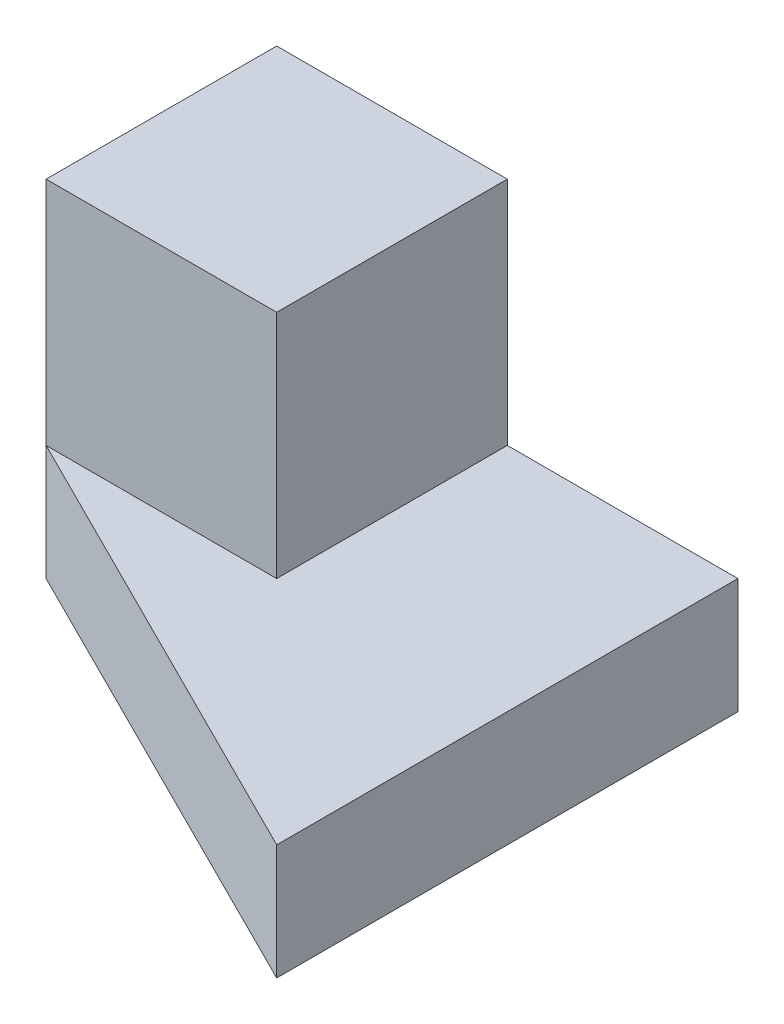
ISO-10303-21;
HEADER;
FILE_DESCRIPTION(('STEP AP214'),'2;1');
FILE_NAME('part.step','',(''),(''),'','','');
FILE_SCHEMA(('AUTOMOTIVE_DESIGN { 1 0 10303 214 1 1 1 1 }'));
ENDSEC;
DATA;
#1=APPLICATION_CONTEXT('core data for automotive mechanical design processes');
#2=APPLICATION_PROTOCOL_DEFINITION('international standard','automotive_design',2000,#1);
#3=PRODUCT_CONTEXT('',#1,'mechanical');
#4=PRODUCT('Part','Part','',(#3));
#5=PRODUCT_RELATED_PRODUCT_CATEGORY('part','',(#4));
#6=PRODUCT_DEFINITION_FORMATION('','',#4);
#7=PRODUCT_DEFINITION_CONTEXT('part definition',#1,'design');
#8=PRODUCT_DEFINITION('design','',#6,#7);
#9=PRODUCT_DEFINITION_SHAPE('','',#8);
#10=(LENGTH_UNIT() NAMED_UNIT(*) SI_UNIT(.MILLI.,.METRE.));
#11=(NAMED_UNIT(*) PLANE_ANGLE_UNIT() SI_UNIT($,.RADIAN.));
#12=(NAMED_UNIT(*) SI_UNIT($,.STERADIAN.) SOLID_ANGLE_UNIT());
#13=UNCERTAINTY_MEASURE_WITH_UNIT(LENGTH_MEASURE(1.E-05),#10,'distance_accuracy_value','');
#14=(GEOMETRIC_REPRESENTATION_CONTEXT(3) GLOBAL_UNCERTAINTY_ASSIGNED_CONTEXT((#13)) GLOBAL_UNIT_ASSIGNED_CONTEXT((#10,
#11,#12)) REPRESENTATION_CONTEXT('',''));
#15=CARTESIAN_POINT('',(0.,0.,0.));
#16=DIRECTION('',(0.,0.,1.));
#17=DIRECTION('',(1.,0.,0.));
#18=AXIS2_PLACEMENT_3D('',#15,#16,#17);
#19=CARTESIAN_POINT('',(0.,10.,0.));
#20=DIRECTION('',(0.447213595499958,0.,-0.894427190999916));
#21=DIRECTION('',(-0.894427190999916,0.,-0.447213595499958));
#22=AXIS2_PLACEMENT_3D('',#19,#20,#21);
#23=PLANE('',#22);
#24=DIRECTION('',(0.894427190999916,0.,0.447213595499958));
#25=VECTOR('',#24,1.);
#26=CARTESIAN_POINT('',(0.,0.,0.));
#27=LINE('',#26,#25);
#28=CARTESIAN_POINT('',(-40.,0.,-20.));
#29=VERTEX_POINT('',#28);
#30=CARTESIAN_POINT('',(0.,0.,0.));
#31=VERTEX_POINT('',#30);
#32=EDGE_CURVE('E68',#29,#31,#27,.T.);
#33=ORIENTED_EDGE('',*,*,#32,.T.);
#34=DIRECTION('',(0.,-1.,0.));
#35=VECTOR('',#34,1.);
#36=CARTESIAN_POINT('',(0.,10.,0.));
#37=LINE('',#36,#35);
#38=CARTESIAN_POINT('',(0.,10.,0.));
#39=VERTEX_POINT('',#38);
#40=EDGE_CURVE('E50',#39,#31,#37,.T.);
#41=ORIENTED_EDGE('',*,*,#40,.F.);
#42=DIRECTION('',(0.894427190999916,0.,0.447213595499958));
#43=VECTOR('',#42,1.);
#44=CARTESIAN_POINT('',(0.,10.,0.));
#45=LINE('',#44,#43);
#46=CARTESIAN_POINT('',(-40.,10.,-20.));
#47=VERTEX_POINT('',#46);
#48=EDGE_CURVE('E142',#47,#39,#45,.T.);
#49=ORIENTED_EDGE('',*,*,#48,.F.);
#50=DIRECTION('',(0.,-1.,0.));
#51=VECTOR('',#50,1.);
#52=CARTESIAN_POINT('',(-40.,10.,-20.));
#53=LINE('',#52,#51);
#54=EDGE_CURVE('E11',#47,#29,#53,.T.);
#55=ORIENTED_EDGE('',*,*,#54,.T.);
#56=EDGE_LOOP('',(#33,#41,#49,#55));
#57=FACE_BOUND('',#56,.T.);
#58=ADVANCED_FACE('F41',(#57),#23,.F.);
#59=CARTESIAN_POINT('',(0.,10.,0.));
#60=DIRECTION('',(-1.,0.,0.));
#61=DIRECTION('',(0.,0.,1.));
#62=AXIS2_PLACEMENT_3D('',#59,#60,#61);
#63=PLANE('',#62);
#64=DIRECTION('',(0.,0.,-1.));
#65=VECTOR('',#64,1.);
#66=CARTESIAN_POINT('',(0.,0.,0.));
#67=LINE('',#66,#65);
#68=CARTESIAN_POINT('',(0.,0.,-40.));
#69=VERTEX_POINT('',#68);
#70=EDGE_CURVE('E130',#31,#69,#67,.T.);
#71=ORIENTED_EDGE('',*,*,#70,.T.);
#72=DIRECTION('',(0.,-1.,0.));
#73=VECTOR('',#72,1.);
#74=CARTESIAN_POINT('',(0.,10.,-40.));
#75=LINE('',#74,#73);
#76=CARTESIAN_POINT('',(0.,10.,-40.));
#77=VERTEX_POINT('',#76);
#78=EDGE_CURVE('E149',#77,#69,#75,.T.);
#79=ORIENTED_EDGE('',*,*,#78,.F.);
#80=DIRECTION('',(0.,0.,-1.));
#81=VECTOR('',#80,1.);
#82=CARTESIAN_POINT('',(0.,10.,0.));
#83=LINE('',#82,#81);
#84=EDGE_CURVE('E58',#39,#77,#83,.T.);
#85=ORIENTED_EDGE('',*,*,#84,.F.);
#86=ORIENTED_EDGE('',*,*,#40,.T.);
#87=EDGE_LOOP('',(#71,#79,#85,#86));
#88=FACE_BOUND('',#87,.T.);
#89=ADVANCED_FACE('F160',(#88),#63,.F.);
#90=CARTESIAN_POINT('',(0.,10.,-40.));
#91=DIRECTION('',(0.,0.,1.));
#92=DIRECTION('',(1.,0.,0.));
#93=AXIS2_PLACEMENT_3D('',#90,#91,#92);
#94=PLANE('',#93);
#95=DIRECTION('',(-1.,0.,0.));
#96=VECTOR('',#95,1.);
#97=CARTESIAN_POINT('',(0.,0.,-40.));
#98=LINE('',#97,#96);
#99=CARTESIAN_POINT('',(-40.,0.,-40.));
#100=VERTEX_POINT('',#99);
#101=EDGE_CURVE('E139',#69,#100,#98,.T.);
#102=ORIENTED_EDGE('',*,*,#101,.T.);
#103=DIRECTION('',(0.,-1.,0.));
#104=VECTOR('',#103,1.);
#105=CARTESIAN_POINT('',(-40.,30.,-40.));
#106=LINE('',#105,#104);
#107=CARTESIAN_POINT('',(-40.,30.,-40.));
#108=VERTEX_POINT('',#107);
#109=EDGE_CURVE('E132',#108,#100,#106,.T.);
#110=ORIENTED_EDGE('',*,*,#109,.F.);
#111=DIRECTION('',(-1.,0.,0.));
#112=VECTOR('',#111,1.);
#113=CARTESIAN_POINT('',(0.,30.,-40.));
#114=LINE('',#113,#112);
#115=CARTESIAN_POINT('',(-20.,30.,-40.));
#116=VERTEX_POINT('',#115);
#117=EDGE_CURVE('E114',#116,#108,#114,.T.);
#118=ORIENTED_EDGE('',*,*,#117,.F.);
#119=DIRECTION('',(0.,-1.,0.));
#120=VECTOR('',#119,1.);
#121=CARTESIAN_POINT('',(-20.,30.,-40.));
#122=LINE('',#121,#120);
#123=CARTESIAN_POINT('',(-20.,10.,-40.));
#124=VERTEX_POINT('',#123);
#125=EDGE_CURVE('E110',#116,#124,#122,.T.);
#126=ORIENTED_EDGE('',*,*,#125,.T.);
#127=DIRECTION('',(-1.,0.,0.));
#128=VECTOR('',#127,1.);
#129=CARTESIAN_POINT('',(0.,10.,-40.));
#130=LINE('',#129,#128);
#131=EDGE_CURVE('E147',#77,#124,#130,.T.);
#132=ORIENTED_EDGE('',*,*,#131,.F.);
#133=ORIENTED_EDGE('',*,*,#78,.T.);
#134=EDGE_LOOP('',(#102,#110,#118,#126,#132,#133));
#135=FACE_BOUND('',#134,.T.);
#136=ADVANCED_FACE('F169',(#135),#94,.F.);
#137=CARTESIAN_POINT('',(0.,10.,0.));
#138=DIRECTION('',(0.,1.,0.));
#139=DIRECTION('',(0.,0.,1.));
#140=AXIS2_PLACEMENT_3D('',#137,#138,#139);
#141=PLANE('',#140);
#142=DIRECTION('',(0.,0.,-1.));
#143=VECTOR('',#142,1.);
#144=CARTESIAN_POINT('',(-20.,10.,0.));
#145=LINE('',#144,#143);
#146=CARTESIAN_POINT('',(-20.,10.,-20.));
#147=VERTEX_POINT('',#146);
#148=EDGE_CURVE('E136',#147,#124,#145,.T.);
#149=ORIENTED_EDGE('',*,*,#148,.F.);
#150=DIRECTION('',(1.,0.,0.));
#151=VECTOR('',#150,1.);
#152=CARTESIAN_POINT('',(0.,10.,-20.));
#153=LINE('',#152,#151);
#154=EDGE_CURVE('E77',#47,#147,#153,.T.);
#155=ORIENTED_EDGE('',*,*,#154,.F.);
#156=ORIENTED_EDGE('',*,*,#48,.T.);
#157=ORIENTED_EDGE('',*,*,#84,.T.);
#158=ORIENTED_EDGE('',*,*,#131,.T.);
#159=EDGE_LOOP('',(#149,#155,#156,#157,#158));
#160=FACE_BOUND('',#159,.T.);
#161=ADVANCED_FACE('F183',(#160),#141,.T.);
#162=CARTESIAN_POINT('',(0.,0.,0.));
#163=DIRECTION('',(0.,1.,0.));
#164=DIRECTION('',(0.,0.,1.));
#165=AXIS2_PLACEMENT_3D('',#162,#163,#164);
#166=PLANE('',#165);
#167=ORIENTED_EDGE('',*,*,#32,.F.);
#168=DIRECTION('',(0.,0.,1.));
#169=VECTOR('',#168,1.);
#170=CARTESIAN_POINT('',(-40.,0.,0.));
#171=LINE('',#170,#169);
#172=EDGE_CURVE('E123',#100,#29,#171,.T.);
#173=ORIENTED_EDGE('',*,*,#172,.F.);
#174=ORIENTED_EDGE('',*,*,#101,.F.);
#175=ORIENTED_EDGE('',*,*,#70,.F.);
#176=EDGE_LOOP('',(#167,#173,#174,#175));
#177=FACE_BOUND('',#176,.T.);
#178=ADVANCED_FACE('F164',(#177),#166,.F.);
#179=CARTESIAN_POINT('',(0.,30.,-20.));
#180=DIRECTION('',(0.,0.,-1.));
#181=DIRECTION('',(-1.,0.,0.));
#182=AXIS2_PLACEMENT_3D('',#179,#180,#181);
#183=PLANE('',#182);
#184=ORIENTED_EDGE('',*,*,#154,.T.);
#185=DIRECTION('',(0.,-1.,0.));
#186=VECTOR('',#185,1.);
#187=CARTESIAN_POINT('',(-20.,30.,-20.));
#188=LINE('',#187,#186);
#189=CARTESIAN_POINT('',(-20.,30.,-20.));
#190=VERTEX_POINT('',#189);
#191=EDGE_CURVE('E107',#190,#147,#188,.T.);
#192=ORIENTED_EDGE('',*,*,#191,.F.);
#193=DIRECTION('',(1.,0.,0.));
#194=VECTOR('',#193,1.);
#195=CARTESIAN_POINT('',(0.,30.,-20.));
#196=LINE('',#195,#194);
#197=CARTESIAN_POINT('',(-40.,30.,-20.));
#198=VERTEX_POINT('',#197);
#199=EDGE_CURVE('E115',#198,#190,#196,.T.);
#200=ORIENTED_EDGE('',*,*,#199,.F.);
#201=DIRECTION('',(0.,-1.,0.));
#202=VECTOR('',#201,1.);
#203=CARTESIAN_POINT('',(-40.,30.,-20.));
#204=LINE('',#203,#202);
#205=EDGE_CURVE('E174',#198,#47,#204,.T.);
#206=ORIENTED_EDGE('',*,*,#205,.T.);
#207=EDGE_LOOP('',(#184,#192,#200,#206));
#208=FACE_BOUND('',#207,.T.);
#209=ADVANCED_FACE('F125',(#208),#183,.F.);
#210=CARTESIAN_POINT('',(-20.,30.,0.));
#211=DIRECTION('',(-1.,0.,0.));
#212=DIRECTION('',(0.,0.,1.));
#213=AXIS2_PLACEMENT_3D('',#210,#211,#212);
#214=PLANE('',#213);
#215=ORIENTED_EDGE('',*,*,#148,.T.);
#216=ORIENTED_EDGE('',*,*,#125,.F.);
#217=DIRECTION('',(0.,0.,-1.));
#218=VECTOR('',#217,1.);
#219=CARTESIAN_POINT('',(-20.,30.,0.));
#220=LINE('',#219,#218);
#221=EDGE_CURVE('E104',#190,#116,#220,.T.);
#222=ORIENTED_EDGE('',*,*,#221,.F.);
#223=ORIENTED_EDGE('',*,*,#191,.T.);
#224=EDGE_LOOP('',(#215,#216,#222,#223));
#225=FACE_BOUND('',#224,.T.);
#226=ADVANCED_FACE('F106',(#225),#214,.F.);
#227=CARTESIAN_POINT('',(-40.,30.,0.));
#228=DIRECTION('',(1.,0.,0.));
#229=DIRECTION('',(0.,0.,-1.));
#230=AXIS2_PLACEMENT_3D('',#227,#228,#229);
#231=PLANE('',#230);
#232=ORIENTED_EDGE('',*,*,#172,.T.);
#233=ORIENTED_EDGE('',*,*,#54,.F.);
#234=ORIENTED_EDGE('',*,*,#205,.F.);
#235=DIRECTION('',(0.,0.,1.));
#236=VECTOR('',#235,1.);
#237=CARTESIAN_POINT('',(-40.,30.,0.));
#238=LINE('',#237,#236);
#239=EDGE_CURVE('E120',#108,#198,#238,.T.);
#240=ORIENTED_EDGE('',*,*,#239,.F.);
#241=ORIENTED_EDGE('',*,*,#109,.T.);
#242=EDGE_LOOP('',(#232,#233,#234,#240,#241));
#243=FACE_BOUND('',#242,.T.);
#244=ADVANCED_FACE('F172',(#243),#231,.F.);
#245=CARTESIAN_POINT('',(0.,30.,0.));
#246=DIRECTION('',(0.,1.,0.));
#247=DIRECTION('',(0.,0.,1.));
#248=AXIS2_PLACEMENT_3D('',#245,#246,#247);
#249=PLANE('',#248);
#250=ORIENTED_EDGE('',*,*,#199,.T.);
#251=ORIENTED_EDGE('',*,*,#221,.T.);
#252=ORIENTED_EDGE('',*,*,#117,.T.);
#253=ORIENTED_EDGE('',*,*,#239,.T.);
#254=EDGE_LOOP('',(#250,#251,#252,#253));
#255=FACE_BOUND('',#254,.T.);
#256=ADVANCED_FACE('F118',(#255),#249,.T.);
#257=CLOSED_SHELL('',(#58,#89,#136,#161,#178,#209,#226,#244,#256));
#258=MANIFOLD_SOLID_BREP('B2',#257);
#259=ADVANCED_BREP_SHAPE_REPRESENTATION('',(#18,#258),#14);
#260=SHAPE_DEFINITION_REPRESENTATION(#9,#259);
ENDSEC;
END-ISO-10303-21;
